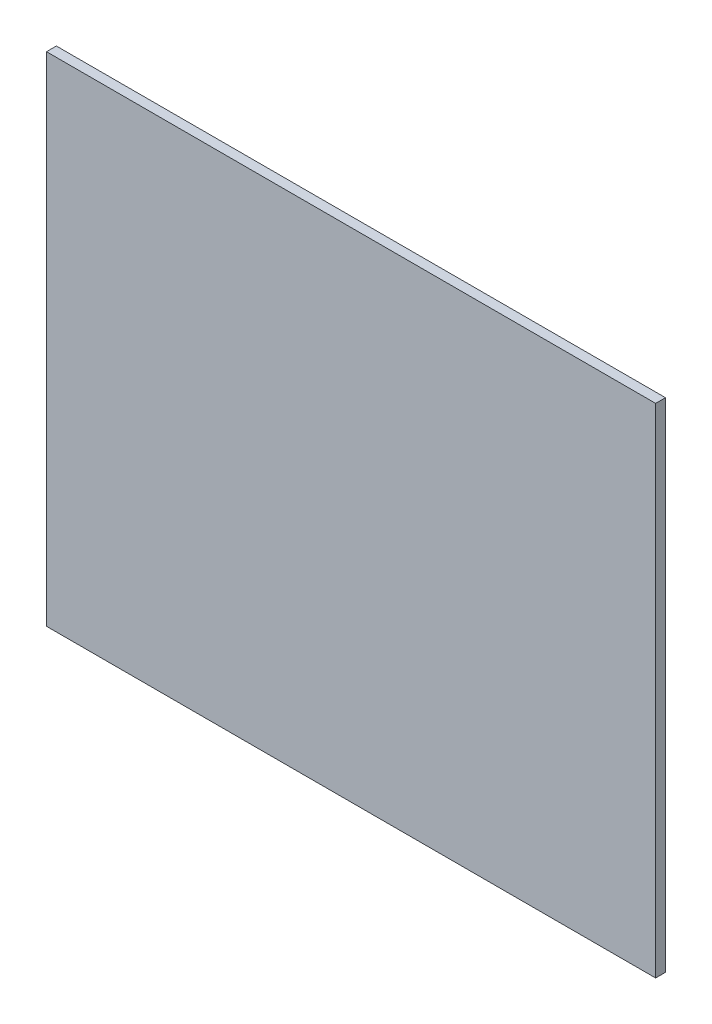
ISO-10303-21;
HEADER;
FILE_DESCRIPTION(('STEP AP214'),'2;1');
FILE_NAME('part.step','',(''),(''),'','','');
FILE_SCHEMA(('AUTOMOTIVE_DESIGN { 1 0 10303 214 1 1 1 1 }'));
ENDSEC;
DATA;
#1=APPLICATION_CONTEXT('core data for automotive mechanical design processes');
#2=APPLICATION_PROTOCOL_DEFINITION('international standard','automotive_design',2000,#1);
#3=PRODUCT_CONTEXT('',#1,'mechanical');
#4=PRODUCT('Part','Part','',(#3));
#5=PRODUCT_RELATED_PRODUCT_CATEGORY('part','',(#4));
#6=PRODUCT_DEFINITION_FORMATION('','',#4);
#7=PRODUCT_DEFINITION_CONTEXT('part definition',#1,'design');
#8=PRODUCT_DEFINITION('design','',#6,#7);
#9=PRODUCT_DEFINITION_SHAPE('','',#8);
#10=(LENGTH_UNIT() NAMED_UNIT(*) SI_UNIT(.MILLI.,.METRE.));
#11=(NAMED_UNIT(*) PLANE_ANGLE_UNIT() SI_UNIT($,.RADIAN.));
#12=(NAMED_UNIT(*) SI_UNIT($,.STERADIAN.) SOLID_ANGLE_UNIT());
#13=UNCERTAINTY_MEASURE_WITH_UNIT(LENGTH_MEASURE(1.E-05),#10,'distance_accuracy_value','');
#14=(GEOMETRIC_REPRESENTATION_CONTEXT(3) GLOBAL_UNCERTAINTY_ASSIGNED_CONTEXT((#13)) GLOBAL_UNIT_ASSIGNED_CONTEXT((#10,
#11,#12)) REPRESENTATION_CONTEXT('',''));
#15=CARTESIAN_POINT('',(0.,0.,0.));
#16=DIRECTION('',(0.,0.,1.));
#17=DIRECTION('',(1.,0.,0.));
#18=AXIS2_PLACEMENT_3D('',#15,#16,#17);
#19=CARTESIAN_POINT('',(0.,0.,1.6));
#20=DIRECTION('',(1.,0.,0.));
#21=DIRECTION('',(0.,0.,-1.));
#22=AXIS2_PLACEMENT_3D('',#19,#20,#21);
#23=PLANE('',#22);
#24=DIRECTION('',(0.,-1.,0.));
#25=VECTOR('',#24,1.);
#26=CARTESIAN_POINT('',(0.,0.,0.));
#27=LINE('',#26,#25);
#28=CARTESIAN_POINT('',(0.,80.7474264351168,0.));
#29=VERTEX_POINT('',#28);
#30=CARTESIAN_POINT('',(0.,0.,0.));
#31=VERTEX_POINT('',#30);
#32=EDGE_CURVE('E125',#29,#31,#27,.T.);
#33=ORIENTED_EDGE('',*,*,#32,.T.);
#34=DIRECTION('',(0.,0.,-1.));
#35=VECTOR('',#34,1.);
#36=CARTESIAN_POINT('',(0.,0.,1.6));
#37=LINE('',#36,#35);
#38=CARTESIAN_POINT('',(0.,0.,1.6));
#39=VERTEX_POINT('',#38);
#40=EDGE_CURVE('E11',#39,#31,#37,.T.);
#41=ORIENTED_EDGE('',*,*,#40,.F.);
#42=DIRECTION('',(0.,-1.,0.));
#43=VECTOR('',#42,1.);
#44=CARTESIAN_POINT('',(0.,0.,1.6));
#45=LINE('',#44,#43);
#46=CARTESIAN_POINT('',(0.,80.7474264351168,1.6));
#47=VERTEX_POINT('',#46);
#48=EDGE_CURVE('E109',#47,#39,#45,.T.);
#49=ORIENTED_EDGE('',*,*,#48,.F.);
#50=DIRECTION('',(0.,0.,-1.));
#51=VECTOR('',#50,1.);
#52=CARTESIAN_POINT('',(0.,80.7474264351168,1.6));
#53=LINE('',#52,#51);
#54=EDGE_CURVE('E121',#47,#29,#53,.T.);
#55=ORIENTED_EDGE('',*,*,#54,.T.);
#56=EDGE_LOOP('',(#33,#41,#49,#55));
#57=FACE_BOUND('',#56,.T.);
#58=ADVANCED_FACE('F49',(#57),#23,.F.);
#59=CARTESIAN_POINT('',(0.,0.,1.6));
#60=DIRECTION('',(0.,1.,0.));
#61=DIRECTION('',(0.,0.,1.));
#62=AXIS2_PLACEMENT_3D('',#59,#60,#61);
#63=PLANE('',#62);
#64=DIRECTION('',(1.,0.,0.));
#65=VECTOR('',#64,1.);
#66=CARTESIAN_POINT('',(0.,0.,0.));
#67=LINE('',#66,#65);
#68=CARTESIAN_POINT('',(98.840202878,0.,0.));
#69=VERTEX_POINT('',#68);
#70=EDGE_CURVE('E114',#31,#69,#67,.T.);
#71=ORIENTED_EDGE('',*,*,#70,.T.);
#72=DIRECTION('',(0.,0.,-1.));
#73=VECTOR('',#72,1.);
#74=CARTESIAN_POINT('',(98.840202878,0.,1.6));
#75=LINE('',#74,#73);
#76=CARTESIAN_POINT('',(98.840202878,0.,1.6));
#77=VERTEX_POINT('',#76);
#78=EDGE_CURVE('E58',#77,#69,#75,.T.);
#79=ORIENTED_EDGE('',*,*,#78,.F.);
#80=DIRECTION('',(1.,0.,0.));
#81=VECTOR('',#80,1.);
#82=CARTESIAN_POINT('',(0.,0.,1.6));
#83=LINE('',#82,#81);
#84=EDGE_CURVE('E104',#39,#77,#83,.T.);
#85=ORIENTED_EDGE('',*,*,#84,.F.);
#86=ORIENTED_EDGE('',*,*,#40,.T.);
#87=EDGE_LOOP('',(#71,#79,#85,#86));
#88=FACE_BOUND('',#87,.T.);
#89=ADVANCED_FACE('F113',(#88),#63,.F.);
#90=CARTESIAN_POINT('',(98.840202878,0.,1.6));
#91=DIRECTION('',(-1.,0.,0.));
#92=DIRECTION('',(0.,0.,1.));
#93=AXIS2_PLACEMENT_3D('',#90,#91,#92);
#94=PLANE('',#93);
#95=DIRECTION('',(0.,1.,0.));
#96=VECTOR('',#95,1.);
#97=CARTESIAN_POINT('',(98.840202878,0.,0.));
#98=LINE('',#97,#96);
#99=CARTESIAN_POINT('',(98.840202878,80.7474264351168,0.));
#100=VERTEX_POINT('',#99);
#101=EDGE_CURVE('E90',#69,#100,#98,.T.);
#102=ORIENTED_EDGE('',*,*,#101,.T.);
#103=DIRECTION('',(0.,0.,-1.));
#104=VECTOR('',#103,1.);
#105=CARTESIAN_POINT('',(98.840202878,80.7474264351168,1.6));
#106=LINE('',#105,#104);
#107=CARTESIAN_POINT('',(98.840202878,80.7474264351168,1.6));
#108=VERTEX_POINT('',#107);
#109=EDGE_CURVE('E116',#108,#100,#106,.T.);
#110=ORIENTED_EDGE('',*,*,#109,.F.);
#111=DIRECTION('',(0.,1.,0.));
#112=VECTOR('',#111,1.);
#113=CARTESIAN_POINT('',(98.840202878,0.,1.6));
#114=LINE('',#113,#112);
#115=EDGE_CURVE('E107',#77,#108,#114,.T.);
#116=ORIENTED_EDGE('',*,*,#115,.F.);
#117=ORIENTED_EDGE('',*,*,#78,.T.);
#118=EDGE_LOOP('',(#102,#110,#116,#117));
#119=FACE_BOUND('',#118,.T.);
#120=ADVANCED_FACE('F117',(#119),#94,.F.);
#121=CARTESIAN_POINT('',(0.,80.7474264351168,1.6));
#122=DIRECTION('',(0.,-1.,0.));
#123=DIRECTION('',(0.,0.,-1.));
#124=AXIS2_PLACEMENT_3D('',#121,#122,#123);
#125=PLANE('',#124);
#126=DIRECTION('',(-1.,0.,0.));
#127=VECTOR('',#126,1.);
#128=CARTESIAN_POINT('',(0.,80.7474264351168,0.));
#129=LINE('',#128,#127);
#130=EDGE_CURVE('E96',#100,#29,#129,.T.);
#131=ORIENTED_EDGE('',*,*,#130,.T.);
#132=ORIENTED_EDGE('',*,*,#54,.F.);
#133=DIRECTION('',(-1.,0.,0.));
#134=VECTOR('',#133,1.);
#135=CARTESIAN_POINT('',(0.,80.7474264351168,1.6));
#136=LINE('',#135,#134);
#137=EDGE_CURVE('E69',#108,#47,#136,.T.);
#138=ORIENTED_EDGE('',*,*,#137,.F.);
#139=ORIENTED_EDGE('',*,*,#109,.T.);
#140=EDGE_LOOP('',(#131,#132,#138,#139));
#141=FACE_BOUND('',#140,.T.);
#142=ADVANCED_FACE('F138',(#141),#125,.F.);
#143=CARTESIAN_POINT('',(0.,0.,1.6));
#144=DIRECTION('',(0.,0.,-1.));
#145=DIRECTION('',(-1.,0.,0.));
#146=AXIS2_PLACEMENT_3D('',#143,#144,#145);
#147=PLANE('',#146);
#148=ORIENTED_EDGE('',*,*,#48,.T.);
#149=ORIENTED_EDGE('',*,*,#84,.T.);
#150=ORIENTED_EDGE('',*,*,#115,.T.);
#151=ORIENTED_EDGE('',*,*,#137,.T.);
#152=EDGE_LOOP('',(#148,#149,#150,#151));
#153=FACE_BOUND('',#152,.T.);
#154=ADVANCED_FACE('F105',(#153),#147,.F.);
#155=CARTESIAN_POINT('',(0.,0.,0.));
#156=DIRECTION('',(0.,0.,-1.));
#157=DIRECTION('',(-1.,0.,0.));
#158=AXIS2_PLACEMENT_3D('',#155,#156,#157);
#159=PLANE('',#158);
#160=ORIENTED_EDGE('',*,*,#32,.F.);
#161=ORIENTED_EDGE('',*,*,#130,.F.);
#162=ORIENTED_EDGE('',*,*,#101,.F.);
#163=ORIENTED_EDGE('',*,*,#70,.F.);
#164=EDGE_LOOP('',(#160,#161,#162,#163));
#165=FACE_BOUND('',#164,.T.);
#166=ADVANCED_FACE('F141',(#165),#159,.T.);
#167=CLOSED_SHELL('',(#58,#89,#120,#142,#154,#166));
#168=MANIFOLD_SOLID_BREP('B2',#167);
#169=ADVANCED_BREP_SHAPE_REPRESENTATION('',(#18,#168),#14);
#170=SHAPE_DEFINITION_REPRESENTATION(#9,#169);
ENDSEC;
END-ISO-10303-21;
